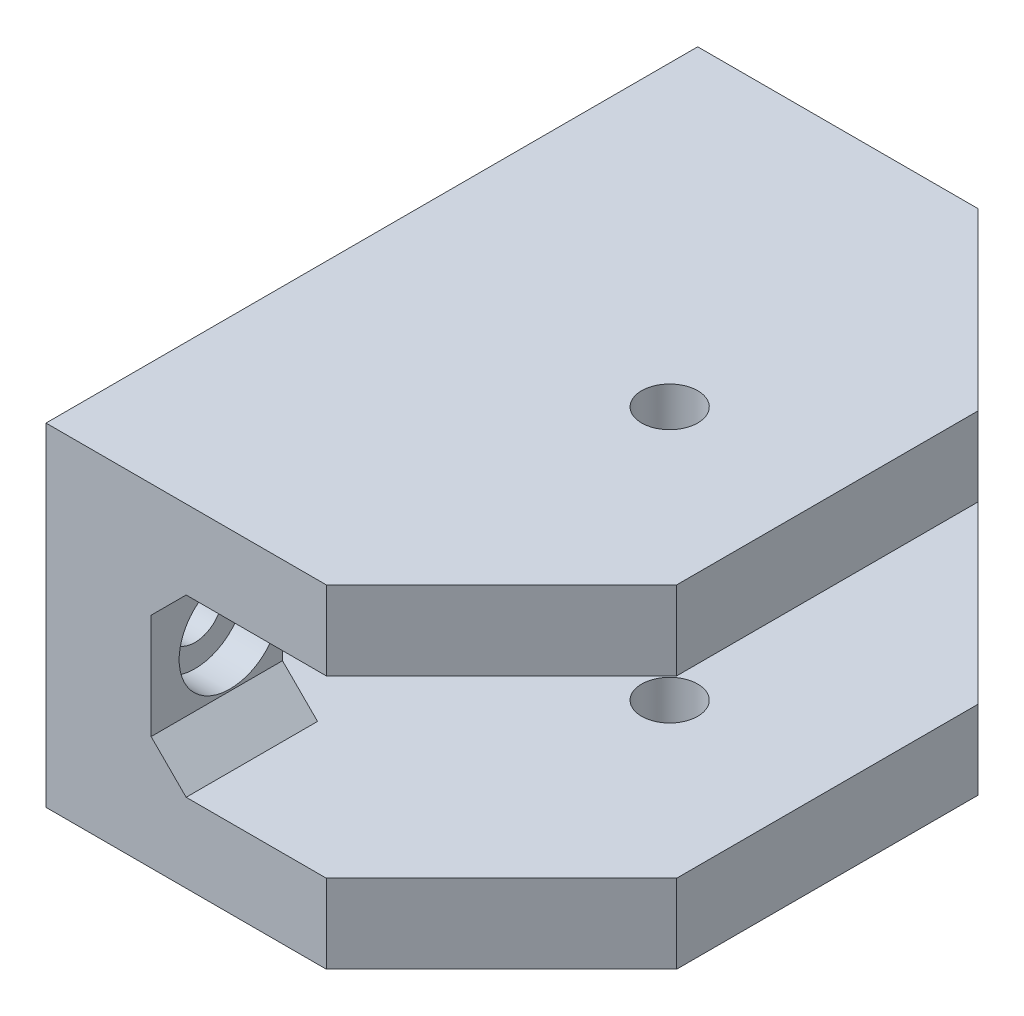
ISO-10303-21;
HEADER;
FILE_DESCRIPTION(('STEP AP214'),'2;1');
FILE_NAME('part.step','',(''),(''),'','','');
FILE_SCHEMA(('AUTOMOTIVE_DESIGN { 1 0 10303 214 1 1 1 1 }'));
ENDSEC;
DATA;
#1=APPLICATION_CONTEXT('core data for automotive mechanical design processes');
#2=APPLICATION_PROTOCOL_DEFINITION('international standard','automotive_design',2000,#1);
#3=PRODUCT_CONTEXT('',#1,'mechanical');
#4=PRODUCT('Part','Part','',(#3));
#5=PRODUCT_RELATED_PRODUCT_CATEGORY('part','',(#4));
#6=PRODUCT_DEFINITION_FORMATION('','',#4);
#7=PRODUCT_DEFINITION_CONTEXT('part definition',#1,'design');
#8=PRODUCT_DEFINITION('design','',#6,#7);
#9=PRODUCT_DEFINITION_SHAPE('','',#8);
#10=(LENGTH_UNIT() NAMED_UNIT(*) SI_UNIT(.MILLI.,.METRE.));
#11=(NAMED_UNIT(*) PLANE_ANGLE_UNIT() SI_UNIT($,.RADIAN.));
#12=(NAMED_UNIT(*) SI_UNIT($,.STERADIAN.) SOLID_ANGLE_UNIT());
#13=UNCERTAINTY_MEASURE_WITH_UNIT(LENGTH_MEASURE(1.E-05),#10,'distance_accuracy_value','');
#14=(GEOMETRIC_REPRESENTATION_CONTEXT(3) GLOBAL_UNCERTAINTY_ASSIGNED_CONTEXT((#13)) GLOBAL_UNIT_ASSIGNED_CONTEXT((#10,
#11,#12)) REPRESENTATION_CONTEXT('',''));
#15=CARTESIAN_POINT('',(0.,0.,0.));
#16=DIRECTION('',(0.,0.,1.));
#17=DIRECTION('',(1.,0.,0.));
#18=AXIS2_PLACEMENT_3D('',#15,#16,#17);
#19=CARTESIAN_POINT('',(38.6006796739622,9.5,30.0860932438735));
#20=DIRECTION('',(1.,0.,0.));
#21=DIRECTION('',(0.,0.,-1.));
#22=AXIS2_PLACEMENT_3D('',#19,#20,#21);
#23=CYLINDRICAL_SURFACE('',#22,1.6);
#24=CARTESIAN_POINT('',(38.6006796739622,9.5,30.0860932438735));
#25=DIRECTION('',(1.,0.,0.));
#26=DIRECTION('',(0.,0.,-1.));
#27=AXIS2_PLACEMENT_3D('',#24,#25,#26);
#28=CIRCLE('',#27,1.6);
#29=CARTESIAN_POINT('',(38.6006796739622,9.5,28.4860932438735));
#30=VERTEX_POINT('',#29);
#31=EDGE_CURVE('E212',#30,#30,#28,.T.);
#32=ORIENTED_EDGE('',*,*,#31,.F.);
#33=EDGE_LOOP('',(#32));
#34=FACE_BOUND('',#33,.T.);
#35=CARTESIAN_POINT('',(42.6006796739622,9.5,30.0860932438735));
#36=DIRECTION('',(1.,0.,0.));
#37=DIRECTION('',(0.,0.,-1.));
#38=AXIS2_PLACEMENT_3D('',#35,#36,#37);
#39=CIRCLE('',#38,1.6);
#40=CARTESIAN_POINT('',(42.6006796739622,9.5,28.4860932438735));
#41=VERTEX_POINT('',#40);
#42=EDGE_CURVE('E40',#41,#41,#39,.F.);
#43=ORIENTED_EDGE('',*,*,#42,.F.);
#44=EDGE_LOOP('',(#43));
#45=FACE_BOUND('',#44,.T.);
#46=ADVANCED_FACE('F36',(#34,#45),#23,.F.);
#47=CARTESIAN_POINT('',(38.6006796739622,9.5,1.8860932438735));
#48=DIRECTION('',(1.,0.,0.));
#49=DIRECTION('',(0.,0.,-1.));
#50=AXIS2_PLACEMENT_3D('',#47,#48,#49);
#51=CYLINDRICAL_SURFACE('',#50,1.6);
#52=CARTESIAN_POINT('',(38.6006796739622,9.5,1.8860932438735));
#53=DIRECTION('',(1.,0.,0.));
#54=DIRECTION('',(0.,0.,-1.));
#55=AXIS2_PLACEMENT_3D('',#52,#53,#54);
#56=CIRCLE('',#55,1.6);
#57=CARTESIAN_POINT('',(38.6006796739622,9.5,0.286093243873498));
#58=VERTEX_POINT('',#57);
#59=EDGE_CURVE('E207',#58,#58,#56,.T.);
#60=ORIENTED_EDGE('',*,*,#59,.F.);
#61=EDGE_LOOP('',(#60));
#62=FACE_BOUND('',#61,.T.);
#63=CARTESIAN_POINT('',(42.6006796739622,9.5,1.8860932438735));
#64=DIRECTION('',(1.,0.,0.));
#65=DIRECTION('',(0.,0.,-1.));
#66=AXIS2_PLACEMENT_3D('',#63,#64,#65);
#67=CIRCLE('',#66,1.6);
#68=CARTESIAN_POINT('',(42.6006796739622,9.5,0.286093243873498));
#69=VERTEX_POINT('',#68);
#70=EDGE_CURVE('E345',#69,#69,#67,.F.);
#71=ORIENTED_EDGE('',*,*,#70,.F.);
#72=EDGE_LOOP('',(#71));
#73=FACE_BOUND('',#72,.T.);
#74=ADVANCED_FACE('F371',(#62,#73),#51,.F.);
#75=CARTESIAN_POINT('',(44.6006796739622,4.5,-2.6139067561265));
#76=DIRECTION('',(-1.,0.,0.));
#77=DIRECTION('',(0.,0.,1.));
#78=AXIS2_PLACEMENT_3D('',#75,#76,#77);
#79=PLANE('',#78);
#80=CARTESIAN_POINT('',(44.6006796739622,9.5,1.8860932438735));
#81=DIRECTION('',(1.,0.,0.));
#82=DIRECTION('',(0.,0.,-1.));
#83=AXIS2_PLACEMENT_3D('',#80,#81,#82);
#84=CIRCLE('',#83,2.9);
#85=CARTESIAN_POINT('',(44.6006796739622,9.5,-1.0139067561265));
#86=VERTEX_POINT('',#85);
#87=EDGE_CURVE('E362',#86,#86,#84,.T.);
#88=ORIENTED_EDGE('',*,*,#87,.F.);
#89=EDGE_LOOP('',(#88));
#90=FACE_BOUND('',#89,.T.);
#91=DIRECTION('',(0.,1.,0.));
#92=VECTOR('',#91,1.);
#93=CARTESIAN_POINT('',(44.6006796739622,4.5,4.8860932438735));
#94=LINE('',#93,#92);
#95=CARTESIAN_POINT('',(44.6006796739622,6.49999999999999,4.8860932438735));
#96=VERTEX_POINT('',#95);
#97=CARTESIAN_POINT('',(44.6006796739622,12.5,4.8860932438735));
#98=VERTEX_POINT('',#97);
#99=EDGE_CURVE('E204',#96,#98,#94,.T.);
#100=ORIENTED_EDGE('',*,*,#99,.F.);
#101=DIRECTION('',(0.,0.,-1.));
#102=VECTOR('',#101,1.);
#103=CARTESIAN_POINT('',(44.6006796739622,6.49999999999999,-2.6139067561265));
#104=LINE('',#103,#102);
#105=CARTESIAN_POINT('',(44.6006796739622,6.49999999999999,-2.6139067561265));
#106=VERTEX_POINT('',#105);
#107=EDGE_CURVE('E325',#96,#106,#104,.T.);
#108=ORIENTED_EDGE('',*,*,#107,.T.);
#109=DIRECTION('',(0.,-1.,0.));
#110=VECTOR('',#109,1.);
#111=CARTESIAN_POINT('',(44.6006796739622,4.5,-2.6139067561265));
#112=LINE('',#111,#110);
#113=CARTESIAN_POINT('',(44.6006796739622,12.5,-2.6139067561265));
#114=VERTEX_POINT('',#113);
#115=EDGE_CURVE('E263',#114,#106,#112,.T.);
#116=ORIENTED_EDGE('',*,*,#115,.F.);
#117=DIRECTION('',(0.,0.,1.));
#118=VECTOR('',#117,1.);
#119=CARTESIAN_POINT('',(44.6006796739622,12.5,4.8860932438735));
#120=LINE('',#119,#118);
#121=EDGE_CURVE('E322',#114,#98,#120,.T.);
#122=ORIENTED_EDGE('',*,*,#121,.T.);
#123=EDGE_LOOP('',(#100,#108,#116,#122));
#124=FACE_BOUND('',#123,.T.);
#125=ADVANCED_FACE('F374',(#90,#124),#79,.F.);
#126=CARTESIAN_POINT('',(64.6006796739622,19.,34.5860932438735));
#127=DIRECTION('',(-1.,0.,0.));
#128=DIRECTION('',(0.,0.,1.));
#129=AXIS2_PLACEMENT_3D('',#126,#127,#128);
#130=PLANE('',#129);
#131=DIRECTION('',(0.,0.,1.));
#132=VECTOR('',#131,1.);
#133=CARTESIAN_POINT('',(64.6006796739622,4.5,-2.6139067561265));
#134=LINE('',#133,#132);
#135=CARTESIAN_POINT('',(64.6006796739622,4.5,7.3860932438735));
#136=VERTEX_POINT('',#135);
#137=CARTESIAN_POINT('',(64.6006796739622,4.5,24.5860932438735));
#138=VERTEX_POINT('',#137);
#139=EDGE_CURVE('E275',#136,#138,#134,.T.);
#140=ORIENTED_EDGE('',*,*,#139,.T.);
#141=DIRECTION('',(0.,-1.,0.));
#142=VECTOR('',#141,1.);
#143=CARTESIAN_POINT('',(64.6006796739622,19.,24.5860932438735));
#144=LINE('',#143,#142);
#145=CARTESIAN_POINT('',(64.6006796739622,0.,24.5860932438735));
#146=VERTEX_POINT('',#145);
#147=EDGE_CURVE('E231',#138,#146,#144,.T.);
#148=ORIENTED_EDGE('',*,*,#147,.T.);
#149=DIRECTION('',(0.,0.,-1.));
#150=VECTOR('',#149,1.);
#151=CARTESIAN_POINT('',(64.6006796739622,0.,34.5860932438735));
#152=LINE('',#151,#150);
#153=CARTESIAN_POINT('',(64.6006796739622,0.,7.3860932438735));
#154=VERTEX_POINT('',#153);
#155=EDGE_CURVE('E299',#146,#154,#152,.T.);
#156=ORIENTED_EDGE('',*,*,#155,.T.);
#157=DIRECTION('',(0.,-1.,0.));
#158=VECTOR('',#157,1.);
#159=CARTESIAN_POINT('',(64.6006796739622,19.,7.3860932438735));
#160=LINE('',#159,#158);
#161=EDGE_CURVE('E237',#136,#154,#160,.T.);
#162=ORIENTED_EDGE('',*,*,#161,.F.);
#163=EDGE_LOOP('',(#140,#148,#156,#162));
#164=FACE_BOUND('',#163,.T.);
#165=ADVANCED_FACE('F380',(#164),#130,.F.);
#166=CARTESIAN_POINT('',(38.6006796739622,19.,34.5860932438735));
#167=DIRECTION('',(1.,0.,0.));
#168=DIRECTION('',(0.,0.,-1.));
#169=AXIS2_PLACEMENT_3D('',#166,#167,#168);
#170=PLANE('',#169);
#171=ORIENTED_EDGE('',*,*,#31,.T.);
#172=EDGE_LOOP('',(#171));
#173=FACE_BOUND('',#172,.T.);
#174=ORIENTED_EDGE('',*,*,#59,.T.);
#175=EDGE_LOOP('',(#174));
#176=FACE_BOUND('',#175,.T.);
#177=DIRECTION('',(0.,0.,-1.));
#178=VECTOR('',#177,1.);
#179=CARTESIAN_POINT('',(38.6006796739622,4.5,4.8860932438735));
#180=LINE('',#179,#178);
#181=CARTESIAN_POINT('',(38.6006796739622,4.5,27.0860932438735));
#182=VERTEX_POINT('',#181);
#183=CARTESIAN_POINT('',(38.6006796739622,4.5,4.8860932438735));
#184=VERTEX_POINT('',#183);
#185=EDGE_CURVE('E187',#182,#184,#180,.T.);
#186=ORIENTED_EDGE('',*,*,#185,.T.);
#187=DIRECTION('',(0.,1.,0.));
#188=VECTOR('',#187,1.);
#189=CARTESIAN_POINT('',(38.6006796739622,4.5,4.8860932438735));
#190=LINE('',#189,#188);
#191=CARTESIAN_POINT('',(38.6006796739622,14.5,4.8860932438735));
#192=VERTEX_POINT('',#191);
#193=EDGE_CURVE('E180',#184,#192,#190,.T.);
#194=ORIENTED_EDGE('',*,*,#193,.T.);
#195=DIRECTION('',(0.,0.,1.));
#196=VECTOR('',#195,1.);
#197=CARTESIAN_POINT('',(38.6006796739622,14.5,4.8860932438735));
#198=LINE('',#197,#196);
#199=CARTESIAN_POINT('',(38.6006796739622,14.5,27.0860932438735));
#200=VERTEX_POINT('',#199);
#201=EDGE_CURVE('E191',#192,#200,#198,.T.);
#202=ORIENTED_EDGE('',*,*,#201,.T.);
#203=DIRECTION('',(0.,-1.,0.));
#204=VECTOR('',#203,1.);
#205=CARTESIAN_POINT('',(38.6006796739622,4.5,27.0860932438735));
#206=LINE('',#205,#204);
#207=EDGE_CURVE('E196',#200,#182,#206,.T.);
#208=ORIENTED_EDGE('',*,*,#207,.T.);
#209=EDGE_LOOP('',(#186,#194,#202,#208));
#210=FACE_BOUND('',#209,.T.);
#211=DIRECTION('',(0.,0.,1.));
#212=VECTOR('',#211,1.);
#213=CARTESIAN_POINT('',(38.6006796739622,0.,34.5860932438735));
#214=LINE('',#213,#212);
#215=CARTESIAN_POINT('',(38.6006796739622,0.,-2.6139067561265));
#216=VERTEX_POINT('',#215);
#217=CARTESIAN_POINT('',(38.6006796739622,0.,34.5860932438735));
#218=VERTEX_POINT('',#217);
#219=EDGE_CURVE('E278',#216,#218,#214,.T.);
#220=ORIENTED_EDGE('',*,*,#219,.T.);
#221=DIRECTION('',(0.,-1.,0.));
#222=VECTOR('',#221,1.);
#223=CARTESIAN_POINT('',(38.6006796739622,19.,34.5860932438735));
#224=LINE('',#223,#222);
#225=CARTESIAN_POINT('',(38.6006796739622,19.,34.5860932438735));
#226=VERTEX_POINT('',#225);
#227=EDGE_CURVE('E305',#226,#218,#224,.T.);
#228=ORIENTED_EDGE('',*,*,#227,.F.);
#229=DIRECTION('',(0.,0.,1.));
#230=VECTOR('',#229,1.);
#231=CARTESIAN_POINT('',(38.6006796739622,19.,34.5860932438735));
#232=LINE('',#231,#230);
#233=CARTESIAN_POINT('',(38.6006796739622,19.,-2.6139067561265));
#234=VERTEX_POINT('',#233);
#235=EDGE_CURVE('E281',#234,#226,#232,.T.);
#236=ORIENTED_EDGE('',*,*,#235,.F.);
#237=DIRECTION('',(0.,-1.,0.));
#238=VECTOR('',#237,1.);
#239=CARTESIAN_POINT('',(38.6006796739622,19.,-2.6139067561265));
#240=LINE('',#239,#238);
#241=EDGE_CURVE('E293',#234,#216,#240,.T.);
#242=ORIENTED_EDGE('',*,*,#241,.T.);
#243=EDGE_LOOP('',(#220,#228,#236,#242));
#244=FACE_BOUND('',#243,.T.);
#245=ADVANCED_FACE('F198',(#173,#176,#210,#244),#170,.F.);
#246=CARTESIAN_POINT('',(38.6006796739622,19.,34.5860932438735));
#247=DIRECTION('',(0.,0.,-1.));
#248=DIRECTION('',(-1.,0.,0.));
#249=AXIS2_PLACEMENT_3D('',#246,#247,#248);
#250=PLANE('',#249);
#251=DIRECTION('',(1.,0.,0.));
#252=VECTOR('',#251,1.);
#253=CARTESIAN_POINT('',(38.6006796739622,0.,34.5860932438735));
#254=LINE('',#253,#252);
#255=CARTESIAN_POINT('',(54.6006796739622,0.,34.5860932438735));
#256=VERTEX_POINT('',#255);
#257=EDGE_CURVE('E296',#218,#256,#254,.T.);
#258=ORIENTED_EDGE('',*,*,#257,.T.);
#259=DIRECTION('',(0.,-1.,0.));
#260=VECTOR('',#259,1.);
#261=CARTESIAN_POINT('',(54.6006796739622,19.,34.5860932438735));
#262=LINE('',#261,#260);
#263=CARTESIAN_POINT('',(54.6006796739622,4.5,34.5860932438735));
#264=VERTEX_POINT('',#263);
#265=EDGE_CURVE('E223',#264,#256,#262,.T.);
#266=ORIENTED_EDGE('',*,*,#265,.F.);
#267=DIRECTION('',(1.,0.,0.));
#268=VECTOR('',#267,1.);
#269=CARTESIAN_POINT('',(64.6006796739622,4.5,34.5860932438735));
#270=LINE('',#269,#268);
#271=CARTESIAN_POINT('',(46.6006796739623,4.5,34.5860932438735));
#272=VERTEX_POINT('',#271);
#273=EDGE_CURVE('E264',#272,#264,#270,.T.);
#274=ORIENTED_EDGE('',*,*,#273,.F.);
#275=DIRECTION('',(0.707106781186551,-0.707106781186544,0.));
#276=VECTOR('',#275,1.);
#277=CARTESIAN_POINT('',(35.3506796739622,15.7499999999999,34.5860932438735));
#278=LINE('',#277,#276);
#279=CARTESIAN_POINT('',(44.6006796739622,6.49999999999999,34.5860932438735));
#280=VERTEX_POINT('',#279);
#281=EDGE_CURVE('E45',#272,#280,#278,.F.);
#282=ORIENTED_EDGE('',*,*,#281,.T.);
#283=DIRECTION('',(0.,-1.,0.));
#284=VECTOR('',#283,1.);
#285=CARTESIAN_POINT('',(44.6006796739622,4.5,34.5860932438735));
#286=LINE('',#285,#284);
#287=CARTESIAN_POINT('',(44.6006796739622,12.5,34.5860932438735));
#288=VERTEX_POINT('',#287);
#289=EDGE_CURVE('E272',#288,#280,#286,.T.);
#290=ORIENTED_EDGE('',*,*,#289,.F.);
#291=DIRECTION('',(-0.707106781186544,-0.707106781186551,0.));
#292=VECTOR('',#291,1.);
#293=CARTESIAN_POINT('',(44.8506796739623,12.75,34.5860932438735));
#294=LINE('',#293,#292);
#295=CARTESIAN_POINT('',(46.6006796739622,14.5,34.5860932438735));
#296=VERTEX_POINT('',#295);
#297=EDGE_CURVE('E60',#288,#296,#294,.F.);
#298=ORIENTED_EDGE('',*,*,#297,.T.);
#299=DIRECTION('',(-1.,0.,0.));
#300=VECTOR('',#299,1.);
#301=CARTESIAN_POINT('',(64.6006796739622,14.5,34.5860932438735));
#302=LINE('',#301,#300);
#303=CARTESIAN_POINT('',(54.6006796739622,14.5,34.5860932438735));
#304=VERTEX_POINT('',#303);
#305=EDGE_CURVE('E259',#304,#296,#302,.T.);
#306=ORIENTED_EDGE('',*,*,#305,.F.);
#307=CARTESIAN_POINT('',(54.6006796739622,19.,34.5860932438735));
#308=VERTEX_POINT('',#307);
#309=EDGE_CURVE('E232',#308,#304,#262,.T.);
#310=ORIENTED_EDGE('',*,*,#309,.F.);
#311=DIRECTION('',(1.,0.,0.));
#312=VECTOR('',#311,1.);
#313=CARTESIAN_POINT('',(38.6006796739622,19.,34.5860932438735));
#314=LINE('',#313,#312);
#315=EDGE_CURVE('E284',#226,#308,#314,.T.);
#316=ORIENTED_EDGE('',*,*,#315,.F.);
#317=ORIENTED_EDGE('',*,*,#227,.T.);
#318=EDGE_LOOP('',(#258,#266,#274,#282,#290,#298,#306,#310,#316,#317));
#319=FACE_BOUND('',#318,.T.);
#320=ADVANCED_FACE('F434',(#319),#250,.F.);
#321=DIRECTION('',(0.,0.,-1.));
#322=VECTOR('',#321,1.);
#323=CARTESIAN_POINT('',(64.6006796739622,19.,34.5860932438735));
#324=LINE('',#323,#322);
#325=CARTESIAN_POINT('',(64.6006796739622,19.,24.5860932438735));
#326=VERTEX_POINT('',#325);
#327=CARTESIAN_POINT('',(64.6006796739622,19.,7.3860932438735));
#328=VERTEX_POINT('',#327);
#329=EDGE_CURVE('E288',#326,#328,#324,.T.);
#330=ORIENTED_EDGE('',*,*,#329,.F.);
#331=CARTESIAN_POINT('',(64.6006796739622,14.5,24.5860932438735));
#332=VERTEX_POINT('',#331);
#333=EDGE_CURVE('E227',#326,#332,#144,.T.);
#334=ORIENTED_EDGE('',*,*,#333,.T.);
#335=DIRECTION('',(0.,0.,1.));
#336=VECTOR('',#335,1.);
#337=CARTESIAN_POINT('',(64.6006796739622,14.5,-2.6139067561265));
#338=LINE('',#337,#336);
#339=CARTESIAN_POINT('',(64.6006796739622,14.5,7.3860932438735));
#340=VERTEX_POINT('',#339);
#341=EDGE_CURVE('E269',#340,#332,#338,.T.);
#342=ORIENTED_EDGE('',*,*,#341,.F.);
#343=EDGE_CURVE('E242',#328,#340,#160,.T.);
#344=ORIENTED_EDGE('',*,*,#343,.F.);
#345=EDGE_LOOP('',(#330,#334,#342,#344));
#346=FACE_BOUND('',#345,.T.);
#347=ADVANCED_FACE('F430',(#346),#130,.F.);
#348=CARTESIAN_POINT('',(38.6006796739622,19.,-2.6139067561265));
#349=DIRECTION('',(0.,0.,1.));
#350=DIRECTION('',(1.,0.,0.));
#351=AXIS2_PLACEMENT_3D('',#348,#349,#350);
#352=PLANE('',#351);
#353=DIRECTION('',(-1.,0.,0.));
#354=VECTOR('',#353,1.);
#355=CARTESIAN_POINT('',(38.6006796739622,19.,-2.6139067561265));
#356=LINE('',#355,#354);
#357=CARTESIAN_POINT('',(54.6006796739622,19.,-2.6139067561265));
#358=VERTEX_POINT('',#357);
#359=EDGE_CURVE('E291',#358,#234,#356,.T.);
#360=ORIENTED_EDGE('',*,*,#359,.F.);
#361=DIRECTION('',(0.,-1.,0.));
#362=VECTOR('',#361,1.);
#363=CARTESIAN_POINT('',(54.6006796739622,19.,-2.6139067561265));
#364=LINE('',#363,#362);
#365=CARTESIAN_POINT('',(54.6006796739622,14.5,-2.6139067561265));
#366=VERTEX_POINT('',#365);
#367=EDGE_CURVE('E226',#358,#366,#364,.T.);
#368=ORIENTED_EDGE('',*,*,#367,.T.);
#369=DIRECTION('',(-1.,0.,0.));
#370=VECTOR('',#369,1.);
#371=CARTESIAN_POINT('',(64.6006796739622,14.5,-2.6139067561265));
#372=LINE('',#371,#370);
#373=CARTESIAN_POINT('',(46.6006796739622,14.5,-2.6139067561265));
#374=VERTEX_POINT('',#373);
#375=EDGE_CURVE('E260',#366,#374,#372,.T.);
#376=ORIENTED_EDGE('',*,*,#375,.T.);
#377=DIRECTION('',(0.707106781186544,0.707106781186551,0.));
#378=VECTOR('',#377,1.);
#379=CARTESIAN_POINT('',(44.8506796739623,12.75,-2.6139067561265));
#380=LINE('',#379,#378);
#381=EDGE_CURVE('E340',#374,#114,#380,.F.);
#382=ORIENTED_EDGE('',*,*,#381,.T.);
#383=ORIENTED_EDGE('',*,*,#115,.T.);
#384=DIRECTION('',(-0.707106781186551,0.707106781186544,0.));
#385=VECTOR('',#384,1.);
#386=CARTESIAN_POINT('',(35.3506796739622,15.7499999999999,-2.6139067561265));
#387=LINE('',#386,#385);
#388=CARTESIAN_POINT('',(46.6006796739623,4.5,-2.6139067561265));
#389=VERTEX_POINT('',#388);
#390=EDGE_CURVE('E337',#106,#389,#387,.F.);
#391=ORIENTED_EDGE('',*,*,#390,.T.);
#392=DIRECTION('',(1.,0.,0.));
#393=VECTOR('',#392,1.);
#394=CARTESIAN_POINT('',(64.6006796739622,4.5,-2.6139067561265));
#395=LINE('',#394,#393);
#396=CARTESIAN_POINT('',(54.6006796739622,4.5,-2.6139067561265));
#397=VERTEX_POINT('',#396);
#398=EDGE_CURVE('E267',#389,#397,#395,.T.);
#399=ORIENTED_EDGE('',*,*,#398,.T.);
#400=CARTESIAN_POINT('',(54.6006796739622,0.,-2.6139067561265));
#401=VERTEX_POINT('',#400);
#402=EDGE_CURVE('E241',#397,#401,#364,.T.);
#403=ORIENTED_EDGE('',*,*,#402,.T.);
#404=DIRECTION('',(-1.,0.,0.));
#405=VECTOR('',#404,1.);
#406=CARTESIAN_POINT('',(38.6006796739622,0.,-2.6139067561265));
#407=LINE('',#406,#405);
#408=EDGE_CURVE('E285',#401,#216,#407,.T.);
#409=ORIENTED_EDGE('',*,*,#408,.T.);
#410=ORIENTED_EDGE('',*,*,#241,.F.);
#411=EDGE_LOOP('',(#360,#368,#376,#382,#383,#391,#399,#403,#409,#410));
#412=FACE_BOUND('',#411,.T.);
#413=ADVANCED_FACE('F423',(#412),#352,.F.);
#414=CARTESIAN_POINT('',(0.,19.,0.));
#415=DIRECTION('',(0.,-1.,0.));
#416=DIRECTION('',(0.,0.,-1.));
#417=AXIS2_PLACEMENT_3D('',#414,#415,#416);
#418=PLANE('',#417);
#419=CARTESIAN_POINT('',(55.6006796739622,19.,15.9860932438735));
#420=DIRECTION('',(0.,-1.,0.));
#421=DIRECTION('',(0.,0.,-1.));
#422=AXIS2_PLACEMENT_3D('',#419,#420,#421);
#423=CIRCLE('',#422,1.6);
#424=CARTESIAN_POINT('',(55.6006796739622,19.,14.3860932438735));
#425=VERTEX_POINT('',#424);
#426=EDGE_CURVE('E250',#425,#425,#423,.T.);
#427=ORIENTED_EDGE('',*,*,#426,.T.);
#428=EDGE_LOOP('',(#427));
#429=FACE_BOUND('',#428,.T.);
#430=ORIENTED_EDGE('',*,*,#315,.T.);
#431=DIRECTION('',(0.707106781186548,0.,-0.707106781186548));
#432=VECTOR('',#431,1.);
#433=CARTESIAN_POINT('',(64.6006796739622,19.,24.5860932438735));
#434=LINE('',#433,#432);
#435=EDGE_CURVE('E220',#308,#326,#434,.T.);
#436=ORIENTED_EDGE('',*,*,#435,.T.);
#437=ORIENTED_EDGE('',*,*,#329,.T.);
#438=DIRECTION('',(-0.707106781186547,0.,-0.707106781186548));
#439=VECTOR('',#438,1.);
#440=CARTESIAN_POINT('',(64.6006796739622,19.,7.3860932438735));
#441=LINE('',#440,#439);
#442=EDGE_CURVE('E234',#328,#358,#441,.T.);
#443=ORIENTED_EDGE('',*,*,#442,.T.);
#444=ORIENTED_EDGE('',*,*,#359,.T.);
#445=ORIENTED_EDGE('',*,*,#235,.T.);
#446=EDGE_LOOP('',(#430,#436,#437,#443,#444,#445));
#447=FACE_BOUND('',#446,.T.);
#448=ADVANCED_FACE('F420',(#429,#447),#418,.F.);
#449=CARTESIAN_POINT('',(0.,0.,0.));
#450=DIRECTION('',(0.,-1.,0.));
#451=DIRECTION('',(0.,0.,-1.));
#452=AXIS2_PLACEMENT_3D('',#449,#450,#451);
#453=PLANE('',#452);
#454=DIRECTION('',(0.707106781186548,0.,-0.707106781186548));
#455=VECTOR('',#454,1.);
#456=CARTESIAN_POINT('',(64.6006796739622,0.,24.5860932438735));
#457=LINE('',#456,#455);
#458=EDGE_CURVE('E224',#256,#146,#457,.T.);
#459=ORIENTED_EDGE('',*,*,#458,.F.);
#460=ORIENTED_EDGE('',*,*,#257,.F.);
#461=ORIENTED_EDGE('',*,*,#219,.F.);
#462=ORIENTED_EDGE('',*,*,#408,.F.);
#463=DIRECTION('',(-0.707106781186547,0.,-0.707106781186548));
#464=VECTOR('',#463,1.);
#465=CARTESIAN_POINT('',(64.6006796739622,0.,7.3860932438735));
#466=LINE('',#465,#464);
#467=EDGE_CURVE('E216',#154,#401,#466,.T.);
#468=ORIENTED_EDGE('',*,*,#467,.F.);
#469=ORIENTED_EDGE('',*,*,#155,.F.);
#470=EDGE_LOOP('',(#459,#460,#461,#462,#468,#469));
#471=FACE_BOUND('',#470,.T.);
#472=CARTESIAN_POINT('',(55.6006796739622,0.,15.9860932438735));
#473=DIRECTION('',(0.,-1.,0.));
#474=DIRECTION('',(0.,0.,-1.));
#475=AXIS2_PLACEMENT_3D('',#472,#473,#474);
#476=CIRCLE('',#475,1.6);
#477=CARTESIAN_POINT('',(55.6006796739622,0.,14.3860932438735));
#478=VERTEX_POINT('',#477);
#479=EDGE_CURVE('E249',#478,#478,#476,.T.);
#480=ORIENTED_EDGE('',*,*,#479,.F.);
#481=EDGE_LOOP('',(#480));
#482=FACE_BOUND('',#481,.T.);
#483=ADVANCED_FACE('F412',(#471,#482),#453,.T.);
#484=CARTESIAN_POINT('',(64.6006796739622,4.5,-2.6139067561265));
#485=DIRECTION('',(0.,-1.,0.));
#486=DIRECTION('',(1.,0.,0.));
#487=AXIS2_PLACEMENT_3D('',#484,#485,#486);
#488=PLANE('',#487);
#489=CARTESIAN_POINT('',(55.6006796739622,4.5,15.9860932438735));
#490=DIRECTION('',(0.,-1.,0.));
#491=DIRECTION('',(1.,0.,0.));
#492=AXIS2_PLACEMENT_3D('',#489,#490,#491);
#493=CIRCLE('',#492,1.6);
#494=CARTESIAN_POINT('',(57.2006796739622,4.5,15.9860932438735));
#495=VERTEX_POINT('',#494);
#496=EDGE_CURVE('E256',#495,#495,#493,.T.);
#497=ORIENTED_EDGE('',*,*,#496,.T.);
#498=EDGE_LOOP('',(#497));
#499=FACE_BOUND('',#498,.T.);
#500=ORIENTED_EDGE('',*,*,#398,.F.);
#501=DIRECTION('',(0.,0.,1.));
#502=VECTOR('',#501,1.);
#503=CARTESIAN_POINT('',(46.6006796739623,4.5,4.8860932438735));
#504=LINE('',#503,#502);
#505=CARTESIAN_POINT('',(46.6006796739623,4.5,4.8860932438735));
#506=VERTEX_POINT('',#505);
#507=EDGE_CURVE('E319',#389,#506,#504,.T.);
#508=ORIENTED_EDGE('',*,*,#507,.T.);
#509=DIRECTION('',(1.,0.,0.));
#510=VECTOR('',#509,1.);
#511=CARTESIAN_POINT('',(38.6006796739622,4.5,4.8860932438735));
#512=LINE('',#511,#510);
#513=EDGE_CURVE('E214',#184,#506,#512,.T.);
#514=ORIENTED_EDGE('',*,*,#513,.F.);
#515=ORIENTED_EDGE('',*,*,#185,.F.);
#516=DIRECTION('',(1.,0.,0.));
#517=VECTOR('',#516,1.);
#518=CARTESIAN_POINT('',(38.6006796739622,4.5,27.0860932438735));
#519=LINE('',#518,#517);
#520=CARTESIAN_POINT('',(46.6006796739623,4.5,27.0860932438735));
#521=VERTEX_POINT('',#520);
#522=EDGE_CURVE('E217',#182,#521,#519,.T.);
#523=ORIENTED_EDGE('',*,*,#522,.T.);
#524=DIRECTION('',(0.,0.,1.));
#525=VECTOR('',#524,1.);
#526=CARTESIAN_POINT('',(46.6006796739623,4.5,34.5860932438735));
#527=LINE('',#526,#525);
#528=EDGE_CURVE('E316',#521,#272,#527,.T.);
#529=ORIENTED_EDGE('',*,*,#528,.T.);
#530=ORIENTED_EDGE('',*,*,#273,.T.);
#531=DIRECTION('',(0.707106781186548,0.,-0.707106781186548));
#532=VECTOR('',#531,1.);
#533=CARTESIAN_POINT('',(78.2006796739622,4.5,10.9860932438735));
#534=LINE('',#533,#532);
#535=EDGE_CURVE('E246',#264,#138,#534,.T.);
#536=ORIENTED_EDGE('',*,*,#535,.T.);
#537=ORIENTED_EDGE('',*,*,#139,.F.);
#538=DIRECTION('',(-0.707106781186547,0.,-0.707106781186548));
#539=VECTOR('',#538,1.);
#540=CARTESIAN_POINT('',(59.6006796739622,4.5,2.3860932438735));
#541=LINE('',#540,#539);
#542=EDGE_CURVE('E230',#136,#397,#541,.T.);
#543=ORIENTED_EDGE('',*,*,#542,.T.);
#544=EDGE_LOOP('',(#500,#508,#514,#515,#523,#529,#530,#536,#537,#543));
#545=FACE_BOUND('',#544,.T.);
#546=ADVANCED_FACE('F410',(#499,#545),#488,.F.);
#547=CARTESIAN_POINT('',(44.6006796739622,9.5000000000012,30.0860932438725));
#548=DIRECTION('',(1.,0.,0.));
#549=DIRECTION('',(0.,0.,-1.));
#550=AXIS2_PLACEMENT_3D('',#547,#548,#549);
#551=CIRCLE('',#550,2.9);
#552=CARTESIAN_POINT('',(44.6006796739622,9.5000000000012,27.1860932438725));
#553=VERTEX_POINT('',#552);
#554=EDGE_CURVE('E352',#553,#553,#551,.T.);
#555=ORIENTED_EDGE('',*,*,#554,.F.);
#556=EDGE_LOOP('',(#555));
#557=FACE_BOUND('',#556,.T.);
#558=DIRECTION('',(0.,-1.,0.));
#559=VECTOR('',#558,1.);
#560=CARTESIAN_POINT('',(44.6006796739622,4.5,27.0860932438735));
#561=LINE('',#560,#559);
#562=CARTESIAN_POINT('',(44.6006796739622,12.5,27.0860932438735));
#563=VERTEX_POINT('',#562);
#564=CARTESIAN_POINT('',(44.6006796739622,6.49999999999999,27.0860932438735));
#565=VERTEX_POINT('',#564);
#566=EDGE_CURVE('E201',#563,#565,#561,.T.);
#567=ORIENTED_EDGE('',*,*,#566,.F.);
#568=DIRECTION('',(0.,0.,1.));
#569=VECTOR('',#568,1.);
#570=CARTESIAN_POINT('',(44.6006796739622,12.5,34.5860932438735));
#571=LINE('',#570,#569);
#572=EDGE_CURVE('E333',#563,#288,#571,.T.);
#573=ORIENTED_EDGE('',*,*,#572,.T.);
#574=ORIENTED_EDGE('',*,*,#289,.T.);
#575=DIRECTION('',(0.,0.,-1.));
#576=VECTOR('',#575,1.);
#577=CARTESIAN_POINT('',(44.6006796739622,6.49999999999999,27.0860932438735));
#578=LINE('',#577,#576);
#579=EDGE_CURVE('E331',#280,#565,#578,.T.);
#580=ORIENTED_EDGE('',*,*,#579,.T.);
#581=EDGE_LOOP('',(#567,#573,#574,#580));
#582=FACE_BOUND('',#581,.T.);
#583=ADVANCED_FACE('F383',(#557,#582),#79,.F.);
#584=CARTESIAN_POINT('',(64.6006796739622,14.5,-2.6139067561265));
#585=DIRECTION('',(0.,1.,0.));
#586=DIRECTION('',(-1.,0.,0.));
#587=AXIS2_PLACEMENT_3D('',#584,#585,#586);
#588=PLANE('',#587);
#589=CARTESIAN_POINT('',(55.6006796739622,14.5,15.9860932438735));
#590=DIRECTION('',(0.,1.,0.));
#591=DIRECTION('',(-1.,0.,0.));
#592=AXIS2_PLACEMENT_3D('',#589,#590,#591);
#593=CIRCLE('',#592,1.6);
#594=CARTESIAN_POINT('',(54.0006796739622,14.5,15.9860932438735));
#595=VERTEX_POINT('',#594);
#596=EDGE_CURVE('E253',#595,#595,#593,.T.);
#597=ORIENTED_EDGE('',*,*,#596,.T.);
#598=EDGE_LOOP('',(#597));
#599=FACE_BOUND('',#598,.T.);
#600=DIRECTION('',(1.,0.,0.));
#601=VECTOR('',#600,1.);
#602=CARTESIAN_POINT('',(38.6006796739622,14.5,4.8860932438735));
#603=LINE('',#602,#601);
#604=CARTESIAN_POINT('',(46.6006796739622,14.5,4.8860932438735));
#605=VERTEX_POINT('',#604);
#606=EDGE_CURVE('E176',#192,#605,#603,.T.);
#607=ORIENTED_EDGE('',*,*,#606,.T.);
#608=DIRECTION('',(0.,0.,-1.));
#609=VECTOR('',#608,1.);
#610=CARTESIAN_POINT('',(46.6006796739622,14.5,-2.6139067561265));
#611=LINE('',#610,#609);
#612=EDGE_CURVE('E329',#605,#374,#611,.T.);
#613=ORIENTED_EDGE('',*,*,#612,.T.);
#614=ORIENTED_EDGE('',*,*,#375,.F.);
#615=DIRECTION('',(0.707106781186547,0.,0.707106781186548));
#616=VECTOR('',#615,1.);
#617=CARTESIAN_POINT('',(59.6006796739622,14.5,2.3860932438735));
#618=LINE('',#617,#616);
#619=EDGE_CURVE('E308',#366,#340,#618,.T.);
#620=ORIENTED_EDGE('',*,*,#619,.T.);
#621=ORIENTED_EDGE('',*,*,#341,.T.);
#622=DIRECTION('',(-0.707106781186548,0.,0.707106781186548));
#623=VECTOR('',#622,1.);
#624=CARTESIAN_POINT('',(78.2006796739622,14.5,10.9860932438735));
#625=LINE('',#624,#623);
#626=EDGE_CURVE('E313',#332,#304,#625,.T.);
#627=ORIENTED_EDGE('',*,*,#626,.T.);
#628=ORIENTED_EDGE('',*,*,#305,.T.);
#629=DIRECTION('',(0.,0.,-1.));
#630=VECTOR('',#629,1.);
#631=CARTESIAN_POINT('',(46.6006796739622,14.5,27.0860932438735));
#632=LINE('',#631,#630);
#633=CARTESIAN_POINT('',(46.6006796739622,14.5,27.0860932438735));
#634=VERTEX_POINT('',#633);
#635=EDGE_CURVE('E327',#296,#634,#632,.T.);
#636=ORIENTED_EDGE('',*,*,#635,.T.);
#637=DIRECTION('',(1.,0.,0.));
#638=VECTOR('',#637,1.);
#639=CARTESIAN_POINT('',(38.6006796739622,14.5,27.0860932438735));
#640=LINE('',#639,#638);
#641=EDGE_CURVE('E186',#200,#634,#640,.T.);
#642=ORIENTED_EDGE('',*,*,#641,.F.);
#643=ORIENTED_EDGE('',*,*,#201,.F.);
#644=EDGE_LOOP('',(#607,#613,#614,#620,#621,#627,#628,#636,#642,#643));
#645=FACE_BOUND('',#644,.T.);
#646=ADVANCED_FACE('F192',(#599,#645),#588,.F.);
#647=CARTESIAN_POINT('',(55.6006796739622,19.,15.9860932438735));
#648=DIRECTION('',(0.,-1.,0.));
#649=DIRECTION('',(0.,0.,-1.));
#650=AXIS2_PLACEMENT_3D('',#647,#648,#649);
#651=CYLINDRICAL_SURFACE('',#650,1.6);
#652=ORIENTED_EDGE('',*,*,#426,.F.);
#653=EDGE_LOOP('',(#652));
#654=FACE_BOUND('',#653,.T.);
#655=ORIENTED_EDGE('',*,*,#596,.F.);
#656=EDGE_LOOP('',(#655));
#657=FACE_BOUND('',#656,.T.);
#658=ADVANCED_FACE('F408',(#654,#657),#651,.F.);
#659=ORIENTED_EDGE('',*,*,#479,.T.);
#660=EDGE_LOOP('',(#659));
#661=FACE_BOUND('',#660,.T.);
#662=ORIENTED_EDGE('',*,*,#496,.F.);
#663=EDGE_LOOP('',(#662));
#664=FACE_BOUND('',#663,.T.);
#665=ADVANCED_FACE('F405',(#661,#664),#651,.F.);
#666=CARTESIAN_POINT('',(64.6006796739622,19.,7.3860932438735));
#667=DIRECTION('',(-0.707106781186548,0.,0.707106781186547));
#668=DIRECTION('',(0.707106781186547,0.,0.707106781186548));
#669=AXIS2_PLACEMENT_3D('',#666,#667,#668);
#670=PLANE('',#669);
#671=ORIENTED_EDGE('',*,*,#367,.F.);
#672=ORIENTED_EDGE('',*,*,#442,.F.);
#673=ORIENTED_EDGE('',*,*,#343,.T.);
#674=ORIENTED_EDGE('',*,*,#619,.F.);
#675=EDGE_LOOP('',(#671,#672,#673,#674));
#676=FACE_BOUND('',#675,.T.);
#677=ADVANCED_FACE('F404',(#676),#670,.F.);
#678=CARTESIAN_POINT('',(64.6006796739622,19.,24.5860932438735));
#679=DIRECTION('',(-0.707106781186548,0.,-0.707106781186548));
#680=DIRECTION('',(-0.707106781186548,0.,0.707106781186548));
#681=AXIS2_PLACEMENT_3D('',#678,#679,#680);
#682=PLANE('',#681);
#683=ORIENTED_EDGE('',*,*,#333,.F.);
#684=ORIENTED_EDGE('',*,*,#435,.F.);
#685=ORIENTED_EDGE('',*,*,#309,.T.);
#686=ORIENTED_EDGE('',*,*,#626,.F.);
#687=EDGE_LOOP('',(#683,#684,#685,#686));
#688=FACE_BOUND('',#687,.T.);
#689=ADVANCED_FACE('F400',(#688),#682,.F.);
#690=ORIENTED_EDGE('',*,*,#161,.T.);
#691=ORIENTED_EDGE('',*,*,#467,.T.);
#692=ORIENTED_EDGE('',*,*,#402,.F.);
#693=ORIENTED_EDGE('',*,*,#542,.F.);
#694=EDGE_LOOP('',(#690,#691,#692,#693));
#695=FACE_BOUND('',#694,.T.);
#696=ADVANCED_FACE('F398',(#695),#670,.F.);
#697=ORIENTED_EDGE('',*,*,#265,.T.);
#698=ORIENTED_EDGE('',*,*,#458,.T.);
#699=ORIENTED_EDGE('',*,*,#147,.F.);
#700=ORIENTED_EDGE('',*,*,#535,.F.);
#701=EDGE_LOOP('',(#697,#698,#699,#700));
#702=FACE_BOUND('',#701,.T.);
#703=ADVANCED_FACE('F395',(#702),#682,.F.);
#704=CARTESIAN_POINT('',(38.6006796739622,4.5,4.8860932438735));
#705=DIRECTION('',(0.,0.,-1.));
#706=DIRECTION('',(-1.,0.,0.));
#707=AXIS2_PLACEMENT_3D('',#704,#705,#706);
#708=PLANE('',#707);
#709=ORIENTED_EDGE('',*,*,#513,.T.);
#710=DIRECTION('',(0.707106781186551,-0.707106781186544,0.));
#711=VECTOR('',#710,1.);
#712=CARTESIAN_POINT('',(42.6006796739622,8.5,4.8860932438735));
#713=LINE('',#712,#711);
#714=EDGE_CURVE('E335',#506,#96,#713,.F.);
#715=ORIENTED_EDGE('',*,*,#714,.T.);
#716=ORIENTED_EDGE('',*,*,#99,.T.);
#717=DIRECTION('',(-0.707106781186544,-0.707106781186551,0.));
#718=VECTOR('',#717,1.);
#719=CARTESIAN_POINT('',(37.6006796739623,5.49999999999996,4.8860932438735));
#720=LINE('',#719,#718);
#721=EDGE_CURVE('E183',#98,#605,#720,.F.);
#722=ORIENTED_EDGE('',*,*,#721,.T.);
#723=ORIENTED_EDGE('',*,*,#606,.F.);
#724=ORIENTED_EDGE('',*,*,#193,.F.);
#725=EDGE_LOOP('',(#709,#715,#716,#722,#723,#724));
#726=FACE_BOUND('',#725,.T.);
#727=ADVANCED_FACE('F178',(#726),#708,.F.);
#728=CARTESIAN_POINT('',(38.6006796739622,4.5,27.0860932438735));
#729=DIRECTION('',(0.,0.,1.));
#730=DIRECTION('',(1.,0.,0.));
#731=AXIS2_PLACEMENT_3D('',#728,#729,#730);
#732=PLANE('',#731);
#733=ORIENTED_EDGE('',*,*,#641,.T.);
#734=DIRECTION('',(0.707106781186544,0.707106781186551,0.));
#735=VECTOR('',#734,1.);
#736=CARTESIAN_POINT('',(37.6006796739623,5.49999999999995,27.0860932438735));
#737=LINE('',#736,#735);
#738=EDGE_CURVE('E343',#634,#563,#737,.F.);
#739=ORIENTED_EDGE('',*,*,#738,.T.);
#740=ORIENTED_EDGE('',*,*,#566,.T.);
#741=DIRECTION('',(-0.707106781186551,0.707106781186544,0.));
#742=VECTOR('',#741,1.);
#743=CARTESIAN_POINT('',(42.6006796739622,8.5,27.0860932438735));
#744=LINE('',#743,#742);
#745=EDGE_CURVE('E11',#565,#521,#744,.F.);
#746=ORIENTED_EDGE('',*,*,#745,.T.);
#747=ORIENTED_EDGE('',*,*,#522,.F.);
#748=ORIENTED_EDGE('',*,*,#207,.F.);
#749=EDGE_LOOP('',(#733,#739,#740,#746,#747,#748));
#750=FACE_BOUND('',#749,.T.);
#751=ADVANCED_FACE('F388',(#750),#732,.F.);
#752=CARTESIAN_POINT('',(46.6006796739623,4.5,-2.6139067561265));
#753=DIRECTION('',(0.707106781186544,0.707106781186551,0.));
#754=DIRECTION('',(0.,0.,-1.));
#755=AXIS2_PLACEMENT_3D('',#752,#753,#754);
#756=PLANE('',#755);
#757=ORIENTED_EDGE('',*,*,#390,.F.);
#758=ORIENTED_EDGE('',*,*,#107,.F.);
#759=ORIENTED_EDGE('',*,*,#714,.F.);
#760=ORIENTED_EDGE('',*,*,#507,.F.);
#761=EDGE_LOOP('',(#757,#758,#759,#760));
#762=FACE_BOUND('',#761,.T.);
#763=ADVANCED_FACE('F391',(#762),#756,.T.);
#764=CARTESIAN_POINT('',(44.6006796739622,12.5,-2.6139067561265));
#765=DIRECTION('',(0.707106781186551,-0.707106781186544,0.));
#766=DIRECTION('',(0.,0.,-1.));
#767=AXIS2_PLACEMENT_3D('',#764,#765,#766);
#768=PLANE('',#767);
#769=ORIENTED_EDGE('',*,*,#381,.F.);
#770=ORIENTED_EDGE('',*,*,#612,.F.);
#771=ORIENTED_EDGE('',*,*,#721,.F.);
#772=ORIENTED_EDGE('',*,*,#121,.F.);
#773=EDGE_LOOP('',(#769,#770,#771,#772));
#774=FACE_BOUND('',#773,.T.);
#775=ADVANCED_FACE('F442',(#774),#768,.T.);
#776=CARTESIAN_POINT('',(44.6006796739622,12.5,-2.6139067561265));
#777=DIRECTION('',(0.707106781186551,-0.707106781186544,0.));
#778=DIRECTION('',(0.,0.,-1.));
#779=AXIS2_PLACEMENT_3D('',#776,#777,#778);
#780=PLANE('',#779);
#781=ORIENTED_EDGE('',*,*,#738,.F.);
#782=ORIENTED_EDGE('',*,*,#635,.F.);
#783=ORIENTED_EDGE('',*,*,#297,.F.);
#784=ORIENTED_EDGE('',*,*,#572,.F.);
#785=EDGE_LOOP('',(#781,#782,#783,#784));
#786=FACE_BOUND('',#785,.T.);
#787=ADVANCED_FACE('F445',(#786),#780,.T.);
#788=CARTESIAN_POINT('',(46.6006796739623,4.5,-2.6139067561265));
#789=DIRECTION('',(0.707106781186544,0.707106781186551,0.));
#790=DIRECTION('',(0.,0.,-1.));
#791=AXIS2_PLACEMENT_3D('',#788,#789,#790);
#792=PLANE('',#791);
#793=ORIENTED_EDGE('',*,*,#745,.F.);
#794=ORIENTED_EDGE('',*,*,#579,.F.);
#795=ORIENTED_EDGE('',*,*,#281,.F.);
#796=ORIENTED_EDGE('',*,*,#528,.F.);
#797=EDGE_LOOP('',(#793,#794,#795,#796));
#798=FACE_BOUND('',#797,.T.);
#799=ADVANCED_FACE('F38',(#798),#792,.T.);
#800=CARTESIAN_POINT('',(42.6006796739622,9.5,1.8860932438735));
#801=DIRECTION('',(1.,0.,0.));
#802=DIRECTION('',(0.,0.,-1.));
#803=AXIS2_PLACEMENT_3D('',#800,#801,#802);
#804=PLANE('',#803);
#805=CARTESIAN_POINT('',(42.6006796739622,9.5,1.8860932438735));
#806=DIRECTION('',(1.,0.,0.));
#807=DIRECTION('',(0.,0.,-1.));
#808=AXIS2_PLACEMENT_3D('',#805,#806,#807);
#809=CIRCLE('',#808,2.9);
#810=CARTESIAN_POINT('',(42.6006796739622,9.5,-1.0139067561265));
#811=VERTEX_POINT('',#810);
#812=EDGE_CURVE('E357',#811,#811,#809,.T.);
#813=ORIENTED_EDGE('',*,*,#812,.T.);
#814=EDGE_LOOP('',(#813));
#815=FACE_BOUND('',#814,.T.);
#816=ORIENTED_EDGE('',*,*,#70,.T.);
#817=EDGE_LOOP('',(#816));
#818=FACE_BOUND('',#817,.T.);
#819=ADVANCED_FACE('F451',(#815,#818),#804,.T.);
#820=CARTESIAN_POINT('',(42.6006796739622,9.5,1.8860932438735));
#821=DIRECTION('',(1.,0.,0.));
#822=DIRECTION('',(0.,0.,-1.));
#823=AXIS2_PLACEMENT_3D('',#820,#821,#822);
#824=CYLINDRICAL_SURFACE('',#823,2.9);
#825=ORIENTED_EDGE('',*,*,#812,.F.);
#826=EDGE_LOOP('',(#825));
#827=FACE_BOUND('',#826,.T.);
#828=ORIENTED_EDGE('',*,*,#87,.T.);
#829=EDGE_LOOP('',(#828));
#830=FACE_BOUND('',#829,.T.);
#831=ADVANCED_FACE('F574',(#827,#830),#824,.F.);
#832=CARTESIAN_POINT('',(42.6006796739622,9.5000000000012,30.0860932438725));
#833=DIRECTION('',(1.,0.,0.));
#834=DIRECTION('',(0.,0.,-1.));
#835=AXIS2_PLACEMENT_3D('',#832,#833,#834);
#836=PLANE('',#835);
#837=CARTESIAN_POINT('',(42.6006796739622,9.5000000000012,30.0860932438725));
#838=DIRECTION('',(1.,0.,0.));
#839=DIRECTION('',(0.,0.,-1.));
#840=AXIS2_PLACEMENT_3D('',#837,#838,#839);
#841=CIRCLE('',#840,2.9);
#842=CARTESIAN_POINT('',(42.6006796739622,9.5000000000012,27.1860932438725));
#843=VERTEX_POINT('',#842);
#844=EDGE_CURVE('E347',#843,#843,#841,.T.);
#845=ORIENTED_EDGE('',*,*,#844,.T.);
#846=EDGE_LOOP('',(#845));
#847=FACE_BOUND('',#846,.T.);
#848=ORIENTED_EDGE('',*,*,#42,.T.);
#849=EDGE_LOOP('',(#848));
#850=FACE_BOUND('',#849,.T.);
#851=ADVANCED_FACE('F584',(#847,#850),#836,.T.);
#852=CARTESIAN_POINT('',(42.6006796739622,9.5000000000012,30.0860932438725));
#853=DIRECTION('',(1.,0.,0.));
#854=DIRECTION('',(0.,0.,-1.));
#855=AXIS2_PLACEMENT_3D('',#852,#853,#854);
#856=CYLINDRICAL_SURFACE('',#855,2.9);
#857=ORIENTED_EDGE('',*,*,#844,.F.);
#858=EDGE_LOOP('',(#857));
#859=FACE_BOUND('',#858,.T.);
#860=ORIENTED_EDGE('',*,*,#554,.T.);
#861=EDGE_LOOP('',(#860));
#862=FACE_BOUND('',#861,.T.);
#863=ADVANCED_FACE('F593',(#859,#862),#856,.F.);
#864=CLOSED_SHELL('',(#46,#74,#125,#165,#245,#320,#347,#413,#448,#483,#546,#583,#646,#658,#665,
#677,#689,#696,#703,#727,#751,#763,#775,#787,#799,#819,#831,#851,#863));
#865=MANIFOLD_SOLID_BREP('B2',#864);
#866=ADVANCED_BREP_SHAPE_REPRESENTATION('',(#18,#865),#14);
#867=SHAPE_DEFINITION_REPRESENTATION(#9,#866);
ENDSEC;
END-ISO-10303-21;
